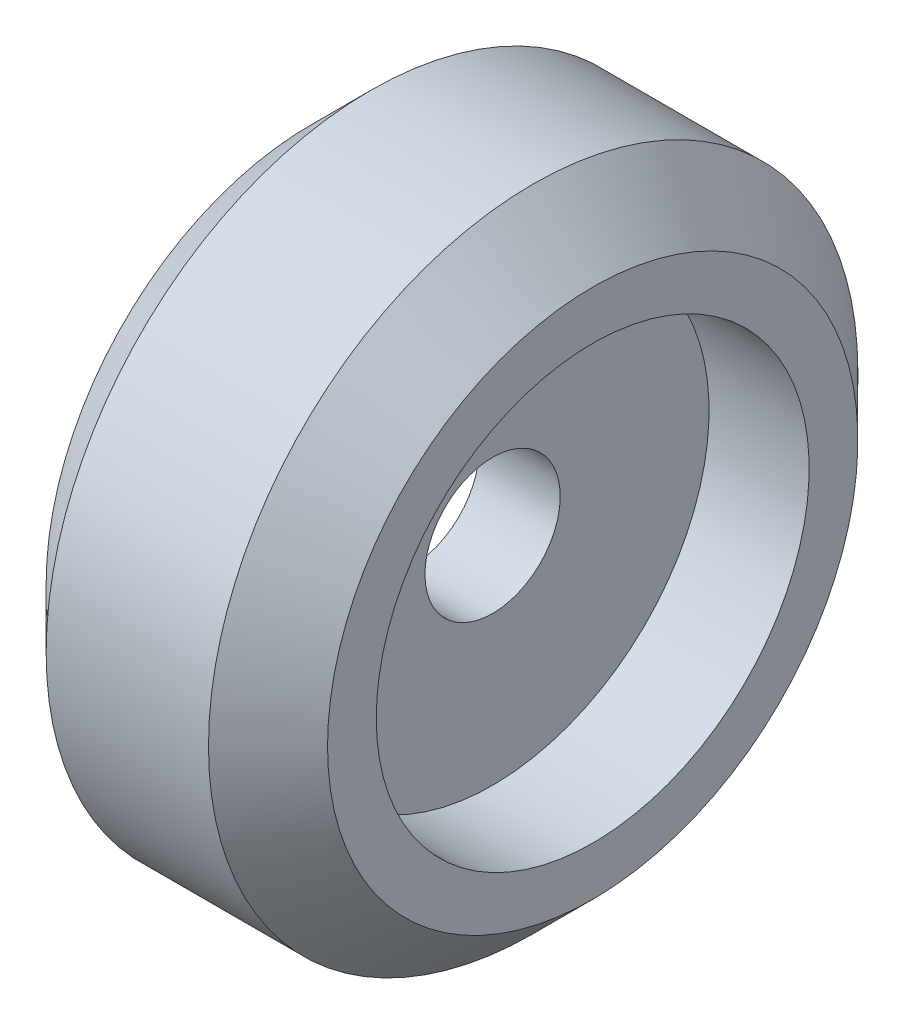
ISO-10303-21;
HEADER;
FILE_DESCRIPTION(('STEP AP214'),'2;1');
FILE_NAME('part.step','',(''),(''),'','','');
FILE_SCHEMA(('AUTOMOTIVE_DESIGN { 1 0 10303 214 1 1 1 1 }'));
ENDSEC;
DATA;
#1=APPLICATION_CONTEXT('core data for automotive mechanical design processes');
#2=APPLICATION_PROTOCOL_DEFINITION('international standard','automotive_design',2000,#1);
#3=PRODUCT_CONTEXT('',#1,'mechanical');
#4=PRODUCT('Part','Part','',(#3));
#5=PRODUCT_RELATED_PRODUCT_CATEGORY('part','',(#4));
#6=PRODUCT_DEFINITION_FORMATION('','',#4);
#7=PRODUCT_DEFINITION_CONTEXT('part definition',#1,'design');
#8=PRODUCT_DEFINITION('design','',#6,#7);
#9=PRODUCT_DEFINITION_SHAPE('','',#8);
#10=(LENGTH_UNIT() NAMED_UNIT(*) SI_UNIT(.MILLI.,.METRE.));
#11=(NAMED_UNIT(*) PLANE_ANGLE_UNIT() SI_UNIT($,.RADIAN.));
#12=(NAMED_UNIT(*) SI_UNIT($,.STERADIAN.) SOLID_ANGLE_UNIT());
#13=UNCERTAINTY_MEASURE_WITH_UNIT(LENGTH_MEASURE(1.E-05),#10,'distance_accuracy_value','');
#14=(GEOMETRIC_REPRESENTATION_CONTEXT(3) GLOBAL_UNCERTAINTY_ASSIGNED_CONTEXT((#13)) GLOBAL_UNIT_ASSIGNED_CONTEXT((#10,
#11,#12)) REPRESENTATION_CONTEXT('',''));
#15=CARTESIAN_POINT('',(0.,0.,0.));
#16=DIRECTION('',(0.,0.,1.));
#17=DIRECTION('',(1.,0.,0.));
#18=AXIS2_PLACEMENT_3D('',#15,#16,#17);
#19=CARTESIAN_POINT('',(0.,0.,0.));
#20=DIRECTION('',(-1.,0.,0.));
#21=DIRECTION('',(0.,0.,1.));
#22=AXIS2_PLACEMENT_3D('',#19,#20,#21);
#23=CYLINDRICAL_SURFACE('',#22,12.);
#24=CARTESIAN_POINT('',(3.,0.,0.));
#25=DIRECTION('',(-1.,0.,0.));
#26=DIRECTION('',(0.,0.,1.));
#27=AXIS2_PLACEMENT_3D('',#24,#25,#26);
#28=CIRCLE('',#27,12.);
#29=CARTESIAN_POINT('',(3.,0.,12.));
#30=VERTEX_POINT('',#29);
#31=EDGE_CURVE('E10',#30,#30,#28,.T.);
#32=ORIENTED_EDGE('',*,*,#31,.T.);
#33=EDGE_LOOP('',(#32));
#34=FACE_BOUND('',#33,.T.);
#35=CARTESIAN_POINT('',(-3.,0.,0.));
#36=DIRECTION('',(-1.,0.,0.));
#37=DIRECTION('',(0.,0.,1.));
#38=AXIS2_PLACEMENT_3D('',#35,#36,#37);
#39=CIRCLE('',#38,12.);
#40=CARTESIAN_POINT('',(-3.,0.,12.));
#41=VERTEX_POINT('',#40);
#42=EDGE_CURVE('E51',#41,#41,#39,.T.);
#43=ORIENTED_EDGE('',*,*,#42,.F.);
#44=EDGE_LOOP('',(#43));
#45=FACE_BOUND('',#44,.T.);
#46=ADVANCED_FACE('F15',(#34,#45),#23,.T.);
#47=CARTESIAN_POINT('',(4.1,0.,0.));
#48=DIRECTION('',(-1.,0.,0.));
#49=DIRECTION('',(0.,0.,1.));
#50=AXIS2_PLACEMENT_3D('',#47,#48,#49);
#51=CONICAL_SURFACE('',#50,10.9000000614673,0.785398135457771);
#52=CARTESIAN_POINT('',(5.2,0.,0.));
#53=DIRECTION('',(-1.,0.,0.));
#54=DIRECTION('',(0.,0.,1.));
#55=AXIS2_PLACEMENT_3D('',#52,#53,#54);
#56=CIRCLE('',#55,9.80000012293458);
#57=CARTESIAN_POINT('',(5.2,0.,9.80000012293458));
#58=VERTEX_POINT('',#57);
#59=EDGE_CURVE('E18',#58,#58,#56,.T.);
#60=ORIENTED_EDGE('',*,*,#59,.T.);
#61=EDGE_LOOP('',(#60));
#62=FACE_BOUND('',#61,.T.);
#63=ORIENTED_EDGE('',*,*,#31,.F.);
#64=EDGE_LOOP('',(#63));
#65=FACE_BOUND('',#64,.T.);
#66=ADVANCED_FACE('F78',(#62,#65),#51,.T.);
#67=CARTESIAN_POINT('',(5.2,0.,9.80000012293458));
#68=DIRECTION('',(1.,0.,0.));
#69=DIRECTION('',(0.,1.,0.));
#70=AXIS2_PLACEMENT_3D('',#67,#68,#69);
#71=PLANE('',#70);
#72=CARTESIAN_POINT('',(5.2,0.,0.));
#73=DIRECTION('',(-1.,0.,0.));
#74=DIRECTION('',(0.,0.,1.));
#75=AXIS2_PLACEMENT_3D('',#72,#73,#74);
#76=CIRCLE('',#75,8.);
#77=CARTESIAN_POINT('',(5.2,0.,8.));
#78=VERTEX_POINT('',#77);
#79=EDGE_CURVE('E30',#78,#78,#76,.T.);
#80=ORIENTED_EDGE('',*,*,#79,.T.);
#81=EDGE_LOOP('',(#80));
#82=FACE_BOUND('',#81,.T.);
#83=ORIENTED_EDGE('',*,*,#59,.F.);
#84=EDGE_LOOP('',(#83));
#85=FACE_BOUND('',#84,.T.);
#86=ADVANCED_FACE('F81',(#82,#85),#71,.T.);
#87=CARTESIAN_POINT('',(3.3500000112,0.,0.));
#88=DIRECTION('',(-1.,0.,0.));
#89=DIRECTION('',(0.,0.,1.));
#90=AXIS2_PLACEMENT_3D('',#87,#88,#89);
#91=CYLINDRICAL_SURFACE('',#90,8.);
#92=ORIENTED_EDGE('',*,*,#79,.F.);
#93=EDGE_LOOP('',(#92));
#94=FACE_BOUND('',#93,.T.);
#95=CARTESIAN_POINT('',(1.5000000224,0.,0.));
#96=DIRECTION('',(-1.,0.,0.));
#97=DIRECTION('',(0.,0.,1.));
#98=AXIS2_PLACEMENT_3D('',#95,#96,#97);
#99=CIRCLE('',#98,8.);
#100=CARTESIAN_POINT('',(1.5000000224,0.,8.));
#101=VERTEX_POINT('',#100);
#102=EDGE_CURVE('E35',#101,#101,#99,.T.);
#103=ORIENTED_EDGE('',*,*,#102,.T.);
#104=EDGE_LOOP('',(#103));
#105=FACE_BOUND('',#104,.T.);
#106=ADVANCED_FACE('F88',(#94,#105),#91,.F.);
#107=CARTESIAN_POINT('',(1.5000000224,0.,8.));
#108=DIRECTION('',(1.,0.,0.));
#109=DIRECTION('',(0.,1.,0.));
#110=AXIS2_PLACEMENT_3D('',#107,#108,#109);
#111=PLANE('',#110);
#112=CARTESIAN_POINT('',(1.50000002235174,0.,0.));
#113=DIRECTION('',(-1.,0.,0.));
#114=DIRECTION('',(0.,0.,1.));
#115=AXIS2_PLACEMENT_3D('',#112,#113,#114);
#116=CIRCLE('',#115,2.5);
#117=CARTESIAN_POINT('',(1.50000002235174,0.,2.5));
#118=VERTEX_POINT('',#117);
#119=EDGE_CURVE('E36',#118,#118,#116,.T.);
#120=ORIENTED_EDGE('',*,*,#119,.T.);
#121=EDGE_LOOP('',(#120));
#122=FACE_BOUND('',#121,.T.);
#123=ORIENTED_EDGE('',*,*,#102,.F.);
#124=EDGE_LOOP('',(#123));
#125=FACE_BOUND('',#124,.T.);
#126=ADVANCED_FACE('F94',(#122,#125),#111,.T.);
#127=CARTESIAN_POINT('',(-2.41290321056908E-11,0.,0.));
#128=DIRECTION('',(-1.,0.,0.));
#129=DIRECTION('',(0.,0.,1.));
#130=AXIS2_PLACEMENT_3D('',#127,#128,#129);
#131=CYLINDRICAL_SURFACE('',#130,2.5);
#132=ORIENTED_EDGE('',*,*,#119,.F.);
#133=EDGE_LOOP('',(#132));
#134=FACE_BOUND('',#133,.T.);
#135=CARTESIAN_POINT('',(-1.5000000224,0.,0.));
#136=DIRECTION('',(-1.,0.,0.));
#137=DIRECTION('',(0.,0.,1.));
#138=AXIS2_PLACEMENT_3D('',#135,#136,#137);
#139=CIRCLE('',#138,2.5);
#140=CARTESIAN_POINT('',(-1.5000000224,0.,2.5));
#141=VERTEX_POINT('',#140);
#142=EDGE_CURVE('E40',#141,#141,#139,.T.);
#143=ORIENTED_EDGE('',*,*,#142,.T.);
#144=EDGE_LOOP('',(#143));
#145=FACE_BOUND('',#144,.T.);
#146=ADVANCED_FACE('F97',(#134,#145),#131,.F.);
#147=CARTESIAN_POINT('',(-1.5000000224,0.,2.5));
#148=DIRECTION('',(-1.,0.,0.));
#149=DIRECTION('',(0.,0.,1.));
#150=AXIS2_PLACEMENT_3D('',#147,#148,#149);
#151=PLANE('',#150);
#152=ORIENTED_EDGE('',*,*,#142,.F.);
#153=EDGE_LOOP('',(#152));
#154=FACE_BOUND('',#153,.T.);
#155=CARTESIAN_POINT('',(-1.5000000224,0.,0.));
#156=DIRECTION('',(-1.,0.,0.));
#157=DIRECTION('',(0.,0.,1.));
#158=AXIS2_PLACEMENT_3D('',#155,#156,#157);
#159=CIRCLE('',#158,8.);
#160=CARTESIAN_POINT('',(-1.5000000224,0.,8.));
#161=VERTEX_POINT('',#160);
#162=EDGE_CURVE('E46',#161,#161,#159,.T.);
#163=ORIENTED_EDGE('',*,*,#162,.T.);
#164=EDGE_LOOP('',(#163));
#165=FACE_BOUND('',#164,.T.);
#166=ADVANCED_FACE('F101',(#154,#165),#151,.T.);
#167=CARTESIAN_POINT('',(-3.3500000112,0.,0.));
#168=DIRECTION('',(-1.,0.,0.));
#169=DIRECTION('',(0.,0.,1.));
#170=AXIS2_PLACEMENT_3D('',#167,#168,#169);
#171=CYLINDRICAL_SURFACE('',#170,8.);
#172=ORIENTED_EDGE('',*,*,#162,.F.);
#173=EDGE_LOOP('',(#172));
#174=FACE_BOUND('',#173,.T.);
#175=CARTESIAN_POINT('',(-5.2,0.,0.));
#176=DIRECTION('',(-1.,0.,0.));
#177=DIRECTION('',(0.,0.,1.));
#178=AXIS2_PLACEMENT_3D('',#175,#176,#177);
#179=CIRCLE('',#178,8.);
#180=CARTESIAN_POINT('',(-5.2,0.,8.));
#181=VERTEX_POINT('',#180);
#182=EDGE_CURVE('E50',#181,#181,#179,.T.);
#183=ORIENTED_EDGE('',*,*,#182,.T.);
#184=EDGE_LOOP('',(#183));
#185=FACE_BOUND('',#184,.T.);
#186=ADVANCED_FACE('F74',(#174,#185),#171,.F.);
#187=CARTESIAN_POINT('',(-5.2,0.,8.));
#188=DIRECTION('',(-1.,0.,0.));
#189=DIRECTION('',(0.,0.,1.));
#190=AXIS2_PLACEMENT_3D('',#187,#188,#189);
#191=PLANE('',#190);
#192=ORIENTED_EDGE('',*,*,#182,.F.);
#193=EDGE_LOOP('',(#192));
#194=FACE_BOUND('',#193,.T.);
#195=CARTESIAN_POINT('',(-5.2,0.,0.));
#196=DIRECTION('',(-1.,0.,0.));
#197=DIRECTION('',(0.,0.,1.));
#198=AXIS2_PLACEMENT_3D('',#195,#196,#197);
#199=CIRCLE('',#198,9.80000012293458);
#200=CARTESIAN_POINT('',(-5.2,0.,9.80000012293458));
#201=VERTEX_POINT('',#200);
#202=EDGE_CURVE('E55',#201,#201,#199,.T.);
#203=ORIENTED_EDGE('',*,*,#202,.T.);
#204=EDGE_LOOP('',(#203));
#205=FACE_BOUND('',#204,.T.);
#206=ADVANCED_FACE('F64',(#194,#205),#191,.T.);
#207=CARTESIAN_POINT('',(-4.1,0.,0.));
#208=DIRECTION('',(1.,0.,0.));
#209=DIRECTION('',(0.,0.,1.));
#210=AXIS2_PLACEMENT_3D('',#207,#208,#209);
#211=CONICAL_SURFACE('',#210,10.9000000614673,0.785398135457771);
#212=ORIENTED_EDGE('',*,*,#42,.T.);
#213=EDGE_LOOP('',(#212));
#214=FACE_BOUND('',#213,.T.);
#215=ORIENTED_EDGE('',*,*,#202,.F.);
#216=EDGE_LOOP('',(#215));
#217=FACE_BOUND('',#216,.T.);
#218=ADVANCED_FACE('F66',(#214,#217),#211,.T.);
#219=CLOSED_SHELL('',(#46,#66,#86,#106,#126,#146,#166,#186,#206,#218));
#220=MANIFOLD_SOLID_BREP('B1',#219);
#221=ADVANCED_BREP_SHAPE_REPRESENTATION('',(#18,#220),#14);
#222=SHAPE_DEFINITION_REPRESENTATION(#9,#221);
ENDSEC;
END-ISO-10303-21;
